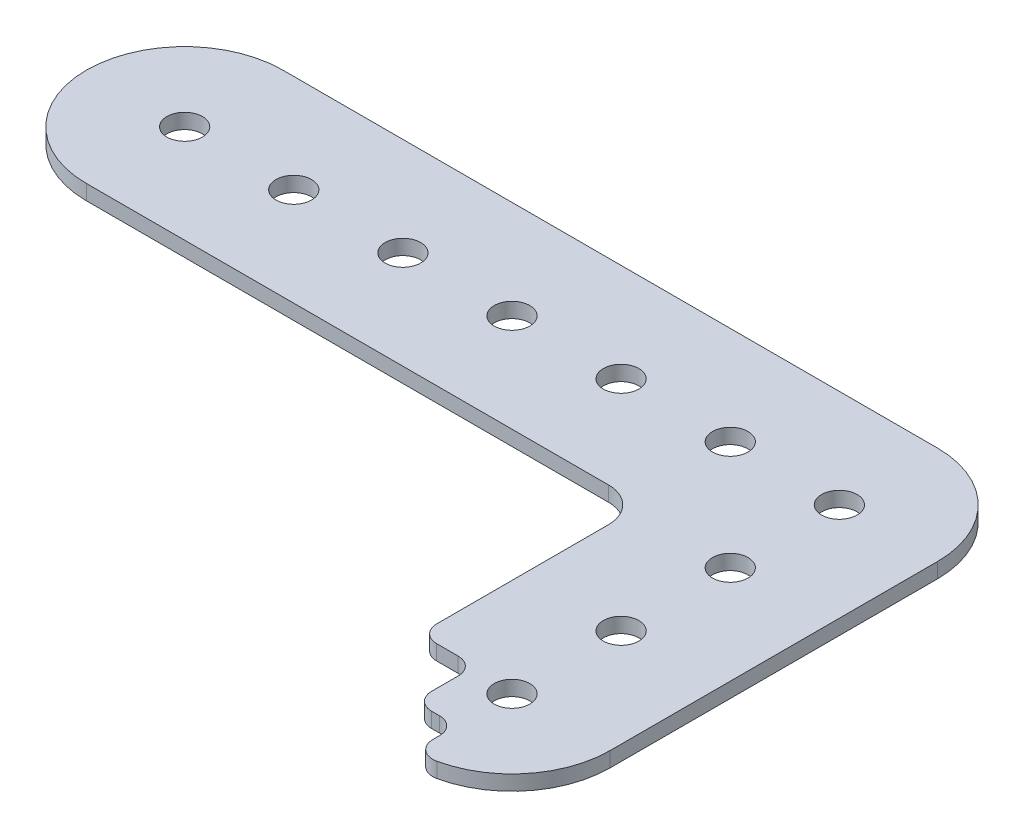
ISO-10303-21;
HEADER;
FILE_DESCRIPTION(('STEP AP214'),'2;1');
FILE_NAME('part.step','',(''),(''),'','','');
FILE_SCHEMA(('AUTOMOTIVE_DESIGN { 1 0 10303 214 1 1 1 1 }'));
ENDSEC;
DATA;
#1=APPLICATION_CONTEXT('core data for automotive mechanical design processes');
#2=APPLICATION_PROTOCOL_DEFINITION('international standard','automotive_design',2000,#1);
#3=PRODUCT_CONTEXT('',#1,'mechanical');
#4=PRODUCT('Part','Part','',(#3));
#5=PRODUCT_RELATED_PRODUCT_CATEGORY('part','',(#4));
#6=PRODUCT_DEFINITION_FORMATION('','',#4);
#7=PRODUCT_DEFINITION_CONTEXT('part definition',#1,'design');
#8=PRODUCT_DEFINITION('design','',#6,#7);
#9=PRODUCT_DEFINITION_SHAPE('','',#8);
#10=(LENGTH_UNIT() NAMED_UNIT(*) SI_UNIT(.MILLI.,.METRE.));
#11=(NAMED_UNIT(*) PLANE_ANGLE_UNIT() SI_UNIT($,.RADIAN.));
#12=(NAMED_UNIT(*) SI_UNIT($,.STERADIAN.) SOLID_ANGLE_UNIT());
#13=UNCERTAINTY_MEASURE_WITH_UNIT(LENGTH_MEASURE(1.E-05),#10,'distance_accuracy_value','');
#14=(GEOMETRIC_REPRESENTATION_CONTEXT(3) GLOBAL_UNCERTAINTY_ASSIGNED_CONTEXT((#13)) GLOBAL_UNIT_ASSIGNED_CONTEXT((#10,
#11,#12)) REPRESENTATION_CONTEXT('',''));
#15=CARTESIAN_POINT('',(0.,0.,0.));
#16=DIRECTION('',(0.,0.,1.));
#17=DIRECTION('',(1.,0.,0.));
#18=AXIS2_PLACEMENT_3D('',#15,#16,#17);
#19=CARTESIAN_POINT('',(11.4299999999997,0.875,0.));
#20=DIRECTION('',(-1.,0.,0.));
#21=DIRECTION('',(0.,0.,1.));
#22=AXIS2_PLACEMENT_3D('',#19,#20,#21);
#23=PLANE('',#22);
#24=DIRECTION('',(0.,0.,-1.));
#25=VECTOR('',#24,1.);
#26=CARTESIAN_POINT('',(11.4299999999997,-0.875,0.));
#27=LINE('',#26,#25);
#28=CARTESIAN_POINT('',(11.4300000000002,-0.875,38.0999999999999));
#29=VERTEX_POINT('',#28);
#30=CARTESIAN_POINT('',(11.4299999999999,-0.875,0.));
#31=VERTEX_POINT('',#30);
#32=EDGE_CURVE('E192',#29,#31,#27,.T.);
#33=ORIENTED_EDGE('',*,*,#32,.T.);
#34=DIRECTION('',(0.,-1.,0.));
#35=VECTOR('',#34,1.);
#36=CARTESIAN_POINT('',(11.4299999999999,0.875,0.));
#37=LINE('',#36,#35);
#38=CARTESIAN_POINT('',(11.4299999999999,0.875,0.));
#39=VERTEX_POINT('',#38);
#40=EDGE_CURVE('E169',#39,#31,#37,.T.);
#41=ORIENTED_EDGE('',*,*,#40,.F.);
#42=DIRECTION('',(0.,0.,-1.));
#43=VECTOR('',#42,1.);
#44=CARTESIAN_POINT('',(11.4299999999997,0.875,0.));
#45=LINE('',#44,#43);
#46=CARTESIAN_POINT('',(11.4300000000002,0.875,38.0999999999999));
#47=VERTEX_POINT('',#46);
#48=EDGE_CURVE('E177',#47,#39,#45,.T.);
#49=ORIENTED_EDGE('',*,*,#48,.F.);
#50=DIRECTION('',(0.,-1.,0.));
#51=VECTOR('',#50,1.);
#52=CARTESIAN_POINT('',(11.4300000000002,0.875,38.0999999999999));
#53=LINE('',#52,#51);
#54=EDGE_CURVE('E277',#47,#29,#53,.T.);
#55=ORIENTED_EDGE('',*,*,#54,.T.);
#56=EDGE_LOOP('',(#33,#41,#49,#55));
#57=FACE_BOUND('',#56,.T.);
#58=ADVANCED_FACE('F44',(#57),#23,.F.);
#59=CARTESIAN_POINT('',(0.,0.875,0.));
#60=DIRECTION('',(0.,-1.,0.));
#61=DIRECTION('',(0.,0.,-1.));
#62=AXIS2_PLACEMENT_3D('',#59,#60,#61);
#63=CYLINDRICAL_SURFACE('',#62,11.43);
#64=CARTESIAN_POINT('',(0.,-0.875,0.));
#65=DIRECTION('',(0.,1.,0.));
#66=DIRECTION('',(0.,0.,1.));
#67=AXIS2_PLACEMENT_3D('',#64,#65,#66);
#68=CIRCLE('',#67,11.43);
#69=CARTESIAN_POINT('',(0.,-0.875,-11.43));
#70=VERTEX_POINT('',#69);
#71=EDGE_CURVE('E386',#31,#70,#68,.T.);
#72=ORIENTED_EDGE('',*,*,#71,.T.);
#73=DIRECTION('',(0.,-1.,0.));
#74=VECTOR('',#73,1.);
#75=CARTESIAN_POINT('',(0.,0.875,-11.43));
#76=LINE('',#75,#74);
#77=CARTESIAN_POINT('',(0.,0.875,-11.43));
#78=VERTEX_POINT('',#77);
#79=EDGE_CURVE('E171',#78,#70,#76,.T.);
#80=ORIENTED_EDGE('',*,*,#79,.F.);
#81=CARTESIAN_POINT('',(0.,0.875,0.));
#82=DIRECTION('',(0.,1.,0.));
#83=DIRECTION('',(0.,0.,1.));
#84=AXIS2_PLACEMENT_3D('',#81,#82,#83);
#85=CIRCLE('',#84,11.43);
#86=EDGE_CURVE('E164',#39,#78,#85,.T.);
#87=ORIENTED_EDGE('',*,*,#86,.F.);
#88=ORIENTED_EDGE('',*,*,#40,.T.);
#89=EDGE_LOOP('',(#72,#80,#87,#88));
#90=FACE_BOUND('',#89,.T.);
#91=ADVANCED_FACE('F167',(#90),#63,.T.);
#92=CARTESIAN_POINT('',(0.,0.875,-11.43));
#93=DIRECTION('',(0.,0.,-1.));
#94=DIRECTION('',(-1.,0.,0.));
#95=AXIS2_PLACEMENT_3D('',#92,#93,#94);
#96=PLANE('',#95);
#97=DIRECTION('',(1.,0.,0.));
#98=VECTOR('',#97,1.);
#99=CARTESIAN_POINT('',(0.,-0.875,-11.43));
#100=LINE('',#99,#98);
#101=CARTESIAN_POINT('',(-76.2,-0.875,-11.4299999999998));
#102=VERTEX_POINT('',#101);
#103=EDGE_CURVE('E383',#102,#70,#100,.T.);
#104=ORIENTED_EDGE('',*,*,#103,.F.);
#105=DIRECTION('',(0.,-1.,0.));
#106=VECTOR('',#105,1.);
#107=CARTESIAN_POINT('',(-76.2,0.875,-11.4299999999998));
#108=LINE('',#107,#106);
#109=CARTESIAN_POINT('',(-76.2,0.875,-11.4299999999998));
#110=VERTEX_POINT('',#109);
#111=EDGE_CURVE('E198',#110,#102,#108,.T.);
#112=ORIENTED_EDGE('',*,*,#111,.F.);
#113=DIRECTION('',(1.,0.,0.));
#114=VECTOR('',#113,1.);
#115=CARTESIAN_POINT('',(0.,0.875,-11.43));
#116=LINE('',#115,#114);
#117=EDGE_CURVE('E176',#110,#78,#116,.T.);
#118=ORIENTED_EDGE('',*,*,#117,.T.);
#119=ORIENTED_EDGE('',*,*,#79,.T.);
#120=EDGE_LOOP('',(#104,#112,#118,#119));
#121=FACE_BOUND('',#120,.T.);
#122=ADVANCED_FACE('F385',(#121),#96,.T.);
#123=CARTESIAN_POINT('',(-76.2,0.875,5.32101756039694E-13));
#124=DIRECTION('',(0.,-1.,0.));
#125=DIRECTION('',(0.,0.,-1.));
#126=AXIS2_PLACEMENT_3D('',#123,#124,#125);
#127=CYLINDRICAL_SURFACE('',#126,11.4300000000002);
#128=CARTESIAN_POINT('',(-76.2,-0.875,5.32101756039694E-13));
#129=DIRECTION('',(0.,1.,0.));
#130=DIRECTION('',(0.,0.,1.));
#131=AXIS2_PLACEMENT_3D('',#128,#129,#130);
#132=CIRCLE('',#131,11.4300000000002);
#133=CARTESIAN_POINT('',(-76.2,-0.875,11.4300000000003));
#134=VERTEX_POINT('',#133);
#135=EDGE_CURVE('E273',#102,#134,#132,.T.);
#136=ORIENTED_EDGE('',*,*,#135,.T.);
#137=DIRECTION('',(0.,-1.,0.));
#138=VECTOR('',#137,1.);
#139=CARTESIAN_POINT('',(-76.2,0.875,11.4300000000003));
#140=LINE('',#139,#138);
#141=CARTESIAN_POINT('',(-76.2,0.875,11.4300000000003));
#142=VERTEX_POINT('',#141);
#143=EDGE_CURVE('E270',#142,#134,#140,.T.);
#144=ORIENTED_EDGE('',*,*,#143,.F.);
#145=CARTESIAN_POINT('',(-76.2,0.875,5.32101756039694E-13));
#146=DIRECTION('',(0.,1.,0.));
#147=DIRECTION('',(0.,0.,1.));
#148=AXIS2_PLACEMENT_3D('',#145,#146,#147);
#149=CIRCLE('',#148,11.4300000000002);
#150=EDGE_CURVE('E252',#110,#142,#149,.T.);
#151=ORIENTED_EDGE('',*,*,#150,.F.);
#152=ORIENTED_EDGE('',*,*,#111,.T.);
#153=EDGE_LOOP('',(#136,#144,#151,#152));
#154=FACE_BOUND('',#153,.T.);
#155=ADVANCED_FACE('F271',(#154),#127,.T.);
#156=CARTESIAN_POINT('',(0.,0.875,11.43));
#157=DIRECTION('',(0.,0.,-1.));
#158=DIRECTION('',(-1.,0.,0.));
#159=AXIS2_PLACEMENT_3D('',#156,#157,#158);
#160=PLANE('',#159);
#161=DIRECTION('',(1.,0.,0.));
#162=VECTOR('',#161,1.);
#163=CARTESIAN_POINT('',(0.,-0.875,11.43));
#164=LINE('',#163,#162);
#165=CARTESIAN_POINT('',(-15.43,-0.875,11.43));
#166=VERTEX_POINT('',#165);
#167=EDGE_CURVE('E281',#134,#166,#164,.T.);
#168=ORIENTED_EDGE('',*,*,#167,.T.);
#169=DIRECTION('',(0.,-1.,0.));
#170=VECTOR('',#169,1.);
#171=CARTESIAN_POINT('',(-15.43,0.875,11.43));
#172=LINE('',#171,#170);
#173=CARTESIAN_POINT('',(-15.43,0.875,11.43));
#174=VERTEX_POINT('',#173);
#175=EDGE_CURVE('E196',#166,#174,#172,.F.);
#176=ORIENTED_EDGE('',*,*,#175,.T.);
#177=DIRECTION('',(1.,0.,0.));
#178=VECTOR('',#177,1.);
#179=CARTESIAN_POINT('',(0.,0.875,11.43));
#180=LINE('',#179,#178);
#181=EDGE_CURVE('E258',#142,#174,#180,.T.);
#182=ORIENTED_EDGE('',*,*,#181,.F.);
#183=ORIENTED_EDGE('',*,*,#143,.T.);
#184=EDGE_LOOP('',(#168,#176,#182,#183));
#185=FACE_BOUND('',#184,.T.);
#186=ADVANCED_FACE('F279',(#185),#160,.F.);
#187=CARTESIAN_POINT('',(-11.43,0.875,0.));
#188=DIRECTION('',(-1.,0.,0.));
#189=DIRECTION('',(0.,0.,1.));
#190=AXIS2_PLACEMENT_3D('',#187,#188,#189);
#191=PLANE('',#190);
#192=DIRECTION('',(0.,0.,-1.));
#193=VECTOR('',#192,1.);
#194=CARTESIAN_POINT('',(-11.43,-0.875,0.));
#195=LINE('',#194,#193);
#196=CARTESIAN_POINT('',(-11.43,-0.875,35.43));
#197=VERTEX_POINT('',#196);
#198=CARTESIAN_POINT('',(-11.43,-0.875,15.43));
#199=VERTEX_POINT('',#198);
#200=EDGE_CURVE('E293',#197,#199,#195,.T.);
#201=ORIENTED_EDGE('',*,*,#200,.F.);
#202=DIRECTION('',(0.,1.,0.));
#203=VECTOR('',#202,1.);
#204=CARTESIAN_POINT('',(-11.43,0.875,35.43));
#205=LINE('',#204,#203);
#206=CARTESIAN_POINT('',(-11.43,0.875,35.43));
#207=VERTEX_POINT('',#206);
#208=EDGE_CURVE('E292',#197,#207,#205,.T.);
#209=ORIENTED_EDGE('',*,*,#208,.T.);
#210=DIRECTION('',(0.,0.,-1.));
#211=VECTOR('',#210,1.);
#212=CARTESIAN_POINT('',(-11.43,0.875,0.));
#213=LINE('',#212,#211);
#214=CARTESIAN_POINT('',(-11.43,0.875,15.43));
#215=VERTEX_POINT('',#214);
#216=EDGE_CURVE('E224',#207,#215,#213,.T.);
#217=ORIENTED_EDGE('',*,*,#216,.T.);
#218=DIRECTION('',(0.,-1.,0.));
#219=VECTOR('',#218,1.);
#220=CARTESIAN_POINT('',(-11.43,0.875,15.43));
#221=LINE('',#220,#219);
#222=EDGE_CURVE('E193',#215,#199,#221,.T.);
#223=ORIENTED_EDGE('',*,*,#222,.T.);
#224=EDGE_LOOP('',(#201,#209,#217,#223));
#225=FACE_BOUND('',#224,.T.);
#226=ADVANCED_FACE('F290',(#225),#191,.T.);
#227=CARTESIAN_POINT('',(0.,0.875,0.));
#228=DIRECTION('',(0.,-1.,0.));
#229=DIRECTION('',(0.,0.,-1.));
#230=AXIS2_PLACEMENT_3D('',#227,#228,#229);
#231=CYLINDRICAL_SURFACE('',#230,2.07);
#232=CARTESIAN_POINT('',(0.,0.875,0.));
#233=DIRECTION('',(0.,1.,0.));
#234=DIRECTION('',(0.,0.,1.));
#235=AXIS2_PLACEMENT_3D('',#232,#233,#234);
#236=CIRCLE('',#235,2.07);
#237=CARTESIAN_POINT('',(0.,0.875,2.07));
#238=VERTEX_POINT('',#237);
#239=EDGE_CURVE('E397',#238,#238,#236,.T.);
#240=ORIENTED_EDGE('',*,*,#239,.T.);
#241=EDGE_LOOP('',(#240));
#242=FACE_BOUND('',#241,.T.);
#243=CARTESIAN_POINT('',(0.,-0.875,0.));
#244=DIRECTION('',(0.,1.,0.));
#245=DIRECTION('',(0.,0.,1.));
#246=AXIS2_PLACEMENT_3D('',#243,#244,#245);
#247=CIRCLE('',#246,2.07);
#248=CARTESIAN_POINT('',(0.,-0.875,2.07));
#249=VERTEX_POINT('',#248);
#250=EDGE_CURVE('E370',#249,#249,#247,.T.);
#251=ORIENTED_EDGE('',*,*,#250,.F.);
#252=EDGE_LOOP('',(#251));
#253=FACE_BOUND('',#252,.T.);
#254=ADVANCED_FACE('F565',(#242,#253),#231,.F.);
#255=CARTESIAN_POINT('',(-25.4,0.875,1.77367252013231E-13));
#256=DIRECTION('',(0.,-1.,0.));
#257=DIRECTION('',(0.,0.,-1.));
#258=AXIS2_PLACEMENT_3D('',#255,#256,#257);
#259=CYLINDRICAL_SURFACE('',#258,2.07);
#260=CARTESIAN_POINT('',(-25.4,0.875,1.77367252013231E-13));
#261=DIRECTION('',(0.,1.,0.));
#262=DIRECTION('',(0.,0.,1.));
#263=AXIS2_PLACEMENT_3D('',#260,#261,#262);
#264=CIRCLE('',#263,2.07);
#265=CARTESIAN_POINT('',(-25.4,0.875,2.07000000000018));
#266=VERTEX_POINT('',#265);
#267=EDGE_CURVE('E402',#266,#266,#264,.T.);
#268=ORIENTED_EDGE('',*,*,#267,.T.);
#269=EDGE_LOOP('',(#268));
#270=FACE_BOUND('',#269,.T.);
#271=CARTESIAN_POINT('',(-25.4,-0.875,1.77367252013231E-13));
#272=DIRECTION('',(0.,1.,0.));
#273=DIRECTION('',(0.,0.,1.));
#274=AXIS2_PLACEMENT_3D('',#271,#272,#273);
#275=CIRCLE('',#274,2.07);
#276=CARTESIAN_POINT('',(-25.4,-0.875,2.07000000000018));
#277=VERTEX_POINT('',#276);
#278=EDGE_CURVE('E367',#277,#277,#275,.T.);
#279=ORIENTED_EDGE('',*,*,#278,.F.);
#280=EDGE_LOOP('',(#279));
#281=FACE_BOUND('',#280,.T.);
#282=ADVANCED_FACE('F594',(#270,#281),#259,.F.);
#283=CARTESIAN_POINT('',(-38.1,0.875,2.66050878019847E-13));
#284=DIRECTION('',(0.,-1.,0.));
#285=DIRECTION('',(0.,0.,-1.));
#286=AXIS2_PLACEMENT_3D('',#283,#284,#285);
#287=CYLINDRICAL_SURFACE('',#286,2.07);
#288=CARTESIAN_POINT('',(-38.1,0.875,2.66050878019847E-13));
#289=DIRECTION('',(0.,1.,0.));
#290=DIRECTION('',(0.,0.,1.));
#291=AXIS2_PLACEMENT_3D('',#288,#289,#290);
#292=CIRCLE('',#291,2.07);
#293=CARTESIAN_POINT('',(-38.1,0.875,2.07000000000027));
#294=VERTEX_POINT('',#293);
#295=EDGE_CURVE('E410',#294,#294,#292,.T.);
#296=ORIENTED_EDGE('',*,*,#295,.T.);
#297=EDGE_LOOP('',(#296));
#298=FACE_BOUND('',#297,.T.);
#299=CARTESIAN_POINT('',(-38.1,-0.875,2.66050878019847E-13));
#300=DIRECTION('',(0.,1.,0.));
#301=DIRECTION('',(0.,0.,1.));
#302=AXIS2_PLACEMENT_3D('',#299,#300,#301);
#303=CIRCLE('',#302,2.07);
#304=CARTESIAN_POINT('',(-38.1,-0.875,2.07000000000027));
#305=VERTEX_POINT('',#304);
#306=EDGE_CURVE('E364',#305,#305,#303,.T.);
#307=ORIENTED_EDGE('',*,*,#306,.F.);
#308=EDGE_LOOP('',(#307));
#309=FACE_BOUND('',#308,.T.);
#310=ADVANCED_FACE('F602',(#298,#309),#287,.F.);
#311=CARTESIAN_POINT('',(-50.8,0.875,3.54734504026462E-13));
#312=DIRECTION('',(0.,-1.,0.));
#313=DIRECTION('',(0.,0.,-1.));
#314=AXIS2_PLACEMENT_3D('',#311,#312,#313);
#315=CYLINDRICAL_SURFACE('',#314,2.07);
#316=CARTESIAN_POINT('',(-50.8,0.875,3.54734504026462E-13));
#317=DIRECTION('',(0.,1.,0.));
#318=DIRECTION('',(0.,0.,1.));
#319=AXIS2_PLACEMENT_3D('',#316,#317,#318);
#320=CIRCLE('',#319,2.07);
#321=CARTESIAN_POINT('',(-50.8,0.875,2.07000000000036));
#322=VERTEX_POINT('',#321);
#323=EDGE_CURVE('E414',#322,#322,#320,.T.);
#324=ORIENTED_EDGE('',*,*,#323,.T.);
#325=EDGE_LOOP('',(#324));
#326=FACE_BOUND('',#325,.T.);
#327=CARTESIAN_POINT('',(-50.8,-0.875,3.54734504026462E-13));
#328=DIRECTION('',(0.,1.,0.));
#329=DIRECTION('',(0.,0.,1.));
#330=AXIS2_PLACEMENT_3D('',#327,#328,#329);
#331=CIRCLE('',#330,2.07);
#332=CARTESIAN_POINT('',(-50.8,-0.875,2.07000000000036));
#333=VERTEX_POINT('',#332);
#334=EDGE_CURVE('E361',#333,#333,#331,.T.);
#335=ORIENTED_EDGE('',*,*,#334,.F.);
#336=EDGE_LOOP('',(#335));
#337=FACE_BOUND('',#336,.T.);
#338=ADVANCED_FACE('F610',(#326,#337),#315,.F.);
#339=CARTESIAN_POINT('',(-63.5,0.875,4.43418130033078E-13));
#340=DIRECTION('',(0.,-1.,0.));
#341=DIRECTION('',(0.,0.,-1.));
#342=AXIS2_PLACEMENT_3D('',#339,#340,#341);
#343=CYLINDRICAL_SURFACE('',#342,2.07);
#344=CARTESIAN_POINT('',(-63.5,0.875,4.43418130033078E-13));
#345=DIRECTION('',(0.,1.,0.));
#346=DIRECTION('',(0.,0.,1.));
#347=AXIS2_PLACEMENT_3D('',#344,#345,#346);
#348=CIRCLE('',#347,2.07);
#349=CARTESIAN_POINT('',(-63.5,0.875,2.07000000000044));
#350=VERTEX_POINT('',#349);
#351=EDGE_CURVE('E419',#350,#350,#348,.T.);
#352=ORIENTED_EDGE('',*,*,#351,.T.);
#353=EDGE_LOOP('',(#352));
#354=FACE_BOUND('',#353,.T.);
#355=CARTESIAN_POINT('',(-63.5,-0.875,4.43418130033078E-13));
#356=DIRECTION('',(0.,1.,0.));
#357=DIRECTION('',(0.,0.,1.));
#358=AXIS2_PLACEMENT_3D('',#355,#356,#357);
#359=CIRCLE('',#358,2.07);
#360=CARTESIAN_POINT('',(-63.5,-0.875,2.07000000000044));
#361=VERTEX_POINT('',#360);
#362=EDGE_CURVE('E358',#361,#361,#359,.T.);
#363=ORIENTED_EDGE('',*,*,#362,.F.);
#364=EDGE_LOOP('',(#363));
#365=FACE_BOUND('',#364,.T.);
#366=ADVANCED_FACE('F618',(#354,#365),#343,.F.);
#367=CARTESIAN_POINT('',(-76.2,0.875,5.32101756039694E-13));
#368=DIRECTION('',(0.,-1.,0.));
#369=DIRECTION('',(0.,0.,-1.));
#370=AXIS2_PLACEMENT_3D('',#367,#368,#369);
#371=CYLINDRICAL_SURFACE('',#370,2.07);
#372=CARTESIAN_POINT('',(-76.2,0.875,5.32101756039694E-13));
#373=DIRECTION('',(0.,1.,0.));
#374=DIRECTION('',(0.,0.,1.));
#375=AXIS2_PLACEMENT_3D('',#372,#373,#374);
#376=CIRCLE('',#375,2.07);
#377=CARTESIAN_POINT('',(-76.2,0.875,2.07000000000053));
#378=VERTEX_POINT('',#377);
#379=EDGE_CURVE('E424',#378,#378,#376,.T.);
#380=ORIENTED_EDGE('',*,*,#379,.T.);
#381=EDGE_LOOP('',(#380));
#382=FACE_BOUND('',#381,.T.);
#383=CARTESIAN_POINT('',(-76.2,-0.875,5.32101756039694E-13));
#384=DIRECTION('',(0.,1.,0.));
#385=DIRECTION('',(0.,0.,1.));
#386=AXIS2_PLACEMENT_3D('',#383,#384,#385);
#387=CIRCLE('',#386,2.07);
#388=CARTESIAN_POINT('',(-76.2,-0.875,2.07000000000053));
#389=VERTEX_POINT('',#388);
#390=EDGE_CURVE('E355',#389,#389,#387,.T.);
#391=ORIENTED_EDGE('',*,*,#390,.F.);
#392=EDGE_LOOP('',(#391));
#393=FACE_BOUND('',#392,.T.);
#394=ADVANCED_FACE('F626',(#382,#393),#371,.F.);
#395=CARTESIAN_POINT('',(1.32247788292465E-13,0.875,12.7));
#396=DIRECTION('',(0.,-1.,0.));
#397=DIRECTION('',(0.,0.,-1.));
#398=AXIS2_PLACEMENT_3D('',#395,#396,#397);
#399=CYLINDRICAL_SURFACE('',#398,2.07);
#400=CARTESIAN_POINT('',(1.32247788292465E-13,0.875,12.7));
#401=DIRECTION('',(0.,1.,0.));
#402=DIRECTION('',(0.,0.,1.));
#403=AXIS2_PLACEMENT_3D('',#400,#401,#402);
#404=CIRCLE('',#403,2.07);
#405=CARTESIAN_POINT('',(1.32247788292465E-13,0.875,14.77));
#406=VERTEX_POINT('',#405);
#407=EDGE_CURVE('E430',#406,#406,#404,.T.);
#408=ORIENTED_EDGE('',*,*,#407,.T.);
#409=EDGE_LOOP('',(#408));
#410=FACE_BOUND('',#409,.T.);
#411=CARTESIAN_POINT('',(1.32247788292465E-13,-0.875,12.7));
#412=DIRECTION('',(0.,1.,0.));
#413=DIRECTION('',(0.,0.,1.));
#414=AXIS2_PLACEMENT_3D('',#411,#412,#413);
#415=CIRCLE('',#414,2.07);
#416=CARTESIAN_POINT('',(1.32247788292465E-13,-0.875,14.77));
#417=VERTEX_POINT('',#416);
#418=EDGE_CURVE('E352',#417,#417,#415,.T.);
#419=ORIENTED_EDGE('',*,*,#418,.F.);
#420=EDGE_LOOP('',(#419));
#421=FACE_BOUND('',#420,.T.);
#422=ADVANCED_FACE('F559',(#410,#421),#399,.F.);
#423=CARTESIAN_POINT('',(-12.7,0.875,0.));
#424=DIRECTION('',(0.,-1.,0.));
#425=DIRECTION('',(0.,0.,-1.));
#426=AXIS2_PLACEMENT_3D('',#423,#424,#425);
#427=CYLINDRICAL_SURFACE('',#426,2.07);
#428=CARTESIAN_POINT('',(-12.7,0.875,0.));
#429=DIRECTION('',(0.,1.,0.));
#430=DIRECTION('',(0.,0.,1.));
#431=AXIS2_PLACEMENT_3D('',#428,#429,#430);
#432=CIRCLE('',#431,2.07);
#433=CARTESIAN_POINT('',(-12.7,0.875,2.07000000000009));
#434=VERTEX_POINT('',#433);
#435=EDGE_CURVE('E223',#434,#434,#432,.T.);
#436=ORIENTED_EDGE('',*,*,#435,.T.);
#437=EDGE_LOOP('',(#436));
#438=FACE_BOUND('',#437,.T.);
#439=CARTESIAN_POINT('',(-12.7,-0.875,0.));
#440=DIRECTION('',(0.,1.,0.));
#441=DIRECTION('',(0.,0.,1.));
#442=AXIS2_PLACEMENT_3D('',#439,#440,#441);
#443=CIRCLE('',#442,2.07);
#444=CARTESIAN_POINT('',(-12.7,-0.875,2.07000000000009));
#445=VERTEX_POINT('',#444);
#446=EDGE_CURVE('E343',#445,#445,#443,.T.);
#447=ORIENTED_EDGE('',*,*,#446,.F.);
#448=EDGE_LOOP('',(#447));
#449=FACE_BOUND('',#448,.T.);
#450=ADVANCED_FACE('F443',(#438,#449),#427,.F.);
#451=CARTESIAN_POINT('',(3.96743364877394E-13,0.875,38.1));
#452=DIRECTION('',(0.,-1.,0.));
#453=DIRECTION('',(0.,0.,-1.));
#454=AXIS2_PLACEMENT_3D('',#451,#452,#453);
#455=CYLINDRICAL_SURFACE('',#454,11.43);
#456=CARTESIAN_POINT('',(3.96743364877394E-13,0.875,38.1));
#457=DIRECTION('',(0.,1.,0.));
#458=DIRECTION('',(0.,0.,1.));
#459=AXIS2_PLACEMENT_3D('',#456,#457,#458);
#460=CIRCLE('',#459,11.43);
#461=CARTESIAN_POINT('',(2.42417815482529,0.875,49.2699713640488));
#462=VERTEX_POINT('',#461);
#463=EDGE_CURVE('E184',#462,#47,#460,.T.);
#464=ORIENTED_EDGE('',*,*,#463,.F.);
#465=DIRECTION('',(0.,-1.,0.));
#466=VECTOR('',#465,1.);
#467=CARTESIAN_POINT('',(2.42417815482529,0.875,49.2699713640488));
#468=LINE('',#467,#466);
#469=CARTESIAN_POINT('',(2.42417815482529,-0.875,49.2699713640488));
#470=VERTEX_POINT('',#469);
#471=EDGE_CURVE('E338',#462,#470,#468,.T.);
#472=ORIENTED_EDGE('',*,*,#471,.T.);
#473=CARTESIAN_POINT('',(3.96743364877394E-13,-0.875,38.1));
#474=DIRECTION('',(0.,1.,0.));
#475=DIRECTION('',(0.,0.,1.));
#476=AXIS2_PLACEMENT_3D('',#473,#474,#475);
#477=CIRCLE('',#476,11.43);
#478=EDGE_CURVE('E341',#470,#29,#477,.T.);
#479=ORIENTED_EDGE('',*,*,#478,.T.);
#480=ORIENTED_EDGE('',*,*,#54,.F.);
#481=EDGE_LOOP('',(#464,#472,#479,#480));
#482=FACE_BOUND('',#481,.T.);
#483=ADVANCED_FACE('F489',(#482),#455,.T.);
#484=CARTESIAN_POINT('',(2.6449557658493E-13,0.875,25.4));
#485=DIRECTION('',(0.,-1.,0.));
#486=DIRECTION('',(0.,0.,-1.));
#487=AXIS2_PLACEMENT_3D('',#484,#485,#486);
#488=CYLINDRICAL_SURFACE('',#487,2.07);
#489=CARTESIAN_POINT('',(2.6449557658493E-13,0.875,25.4));
#490=DIRECTION('',(0.,1.,0.));
#491=DIRECTION('',(0.,0.,1.));
#492=AXIS2_PLACEMENT_3D('',#489,#490,#491);
#493=CIRCLE('',#492,2.07);
#494=CARTESIAN_POINT('',(2.6449557658493E-13,0.875,27.47));
#495=VERTEX_POINT('',#494);
#496=EDGE_CURVE('E189',#495,#495,#493,.T.);
#497=ORIENTED_EDGE('',*,*,#496,.T.);
#498=EDGE_LOOP('',(#497));
#499=FACE_BOUND('',#498,.T.);
#500=CARTESIAN_POINT('',(2.6449557658493E-13,-0.875,25.4));
#501=DIRECTION('',(0.,1.,0.));
#502=DIRECTION('',(0.,0.,1.));
#503=AXIS2_PLACEMENT_3D('',#500,#501,#502);
#504=CIRCLE('',#503,2.07);
#505=CARTESIAN_POINT('',(2.6449557658493E-13,-0.875,27.47));
#506=VERTEX_POINT('',#505);
#507=EDGE_CURVE('E391',#506,#506,#504,.T.);
#508=ORIENTED_EDGE('',*,*,#507,.F.);
#509=EDGE_LOOP('',(#508));
#510=FACE_BOUND('',#509,.T.);
#511=ADVANCED_FACE('F468',(#499,#510),#488,.F.);
#512=CARTESIAN_POINT('',(3.96743364877394E-13,0.875,38.1));
#513=DIRECTION('',(0.,-1.,0.));
#514=DIRECTION('',(0.,0.,-1.));
#515=AXIS2_PLACEMENT_3D('',#512,#513,#514);
#516=CYLINDRICAL_SURFACE('',#515,2.07);
#517=CARTESIAN_POINT('',(3.96743364877394E-13,0.875,38.1));
#518=DIRECTION('',(0.,1.,0.));
#519=DIRECTION('',(0.,0.,1.));
#520=AXIS2_PLACEMENT_3D('',#517,#518,#519);
#521=CIRCLE('',#520,2.07);
#522=CARTESIAN_POINT('',(3.96743364877394E-13,0.875,40.17));
#523=VERTEX_POINT('',#522);
#524=EDGE_CURVE('E376',#523,#523,#521,.T.);
#525=ORIENTED_EDGE('',*,*,#524,.T.);
#526=EDGE_LOOP('',(#525));
#527=FACE_BOUND('',#526,.T.);
#528=CARTESIAN_POINT('',(3.96743364877394E-13,-0.875,38.1));
#529=DIRECTION('',(0.,1.,0.));
#530=DIRECTION('',(0.,0.,1.));
#531=AXIS2_PLACEMENT_3D('',#528,#529,#530);
#532=CIRCLE('',#531,2.07);
#533=CARTESIAN_POINT('',(3.96743364877394E-13,-0.875,40.17));
#534=VERTEX_POINT('',#533);
#535=EDGE_CURVE('E373',#534,#534,#532,.T.);
#536=ORIENTED_EDGE('',*,*,#535,.F.);
#537=EDGE_LOOP('',(#536));
#538=FACE_BOUND('',#537,.T.);
#539=ADVANCED_FACE('F448',(#527,#538),#516,.F.);
#540=CARTESIAN_POINT('',(0.,0.875,0.));
#541=DIRECTION('',(0.,1.,0.));
#542=DIRECTION('',(0.,0.,1.));
#543=AXIS2_PLACEMENT_3D('',#540,#541,#542);
#544=PLANE('',#543);
#545=DIRECTION('',(-1.03303713995051E-13,0.,-1.));
#546=VECTOR('',#545,1.);
#547=CARTESIAN_POINT('',(0.,0.875,0.));
#548=LINE('',#547,#546);
#549=CARTESIAN_POINT('',(4.88786385148662E-12,0.875,47.315470687925));
#550=VERTEX_POINT('',#549);
#551=CARTESIAN_POINT('',(4.80672181218971E-12,0.875,46.5299999999998));
#552=VERTEX_POINT('',#551);
#553=EDGE_CURVE('E525',#550,#552,#548,.T.);
#554=ORIENTED_EDGE('',*,*,#553,.F.);
#555=CARTESIAN_POINT('',(2.00000000000029,0.875,47.3154706879248));
#556=DIRECTION('',(0.,1.,0.));
#557=DIRECTION('',(0.,0.,1.));
#558=AXIS2_PLACEMENT_3D('',#555,#556,#557);
#559=CIRCLE('',#558,2.);
#560=EDGE_CURVE('E340',#550,#462,#559,.T.);
#561=ORIENTED_EDGE('',*,*,#560,.T.);
#562=ORIENTED_EDGE('',*,*,#463,.T.);
#563=ORIENTED_EDGE('',*,*,#48,.T.);
#564=ORIENTED_EDGE('',*,*,#86,.T.);
#565=ORIENTED_EDGE('',*,*,#117,.F.);
#566=ORIENTED_EDGE('',*,*,#150,.T.);
#567=ORIENTED_EDGE('',*,*,#181,.T.);
#568=CARTESIAN_POINT('',(-15.43,0.875,15.43));
#569=DIRECTION('',(0.,1.,0.));
#570=DIRECTION('',(0.,0.,1.));
#571=AXIS2_PLACEMENT_3D('',#568,#569,#570);
#572=CIRCLE('',#571,4.);
#573=EDGE_CURVE('E205',#174,#215,#572,.F.);
#574=ORIENTED_EDGE('',*,*,#573,.T.);
#575=ORIENTED_EDGE('',*,*,#216,.F.);
#576=CARTESIAN_POINT('',(-9.43,0.875,35.43));
#577=DIRECTION('',(0.,1.,0.));
#578=DIRECTION('',(0.,0.,1.));
#579=AXIS2_PLACEMENT_3D('',#576,#577,#578);
#580=CIRCLE('',#579,2.);
#581=CARTESIAN_POINT('',(-9.43,0.875,37.43));
#582=VERTEX_POINT('',#581);
#583=EDGE_CURVE('E219',#207,#582,#580,.T.);
#584=ORIENTED_EDGE('',*,*,#583,.T.);
#585=DIRECTION('',(-1.,0.,0.));
#586=VECTOR('',#585,1.);
#587=CARTESIAN_POINT('',(0.,0.875,37.43));
#588=LINE('',#587,#586);
#589=CARTESIAN_POINT('',(-6.9299999999998,0.875,37.43));
#590=VERTEX_POINT('',#589);
#591=EDGE_CURVE('E310',#590,#582,#588,.T.);
#592=ORIENTED_EDGE('',*,*,#591,.F.);
#593=CARTESIAN_POINT('',(-6.9299999999998,0.875,39.43));
#594=DIRECTION('',(0.,1.,0.));
#595=DIRECTION('',(0.,0.,1.));
#596=AXIS2_PLACEMENT_3D('',#593,#594,#595);
#597=CIRCLE('',#596,2.);
#598=CARTESIAN_POINT('',(-4.9299999999998,0.875,39.43));
#599=VERTEX_POINT('',#598);
#600=EDGE_CURVE('E52',#590,#599,#597,.F.);
#601=ORIENTED_EDGE('',*,*,#600,.T.);
#602=DIRECTION('',(0.,0.,-1.));
#603=VECTOR('',#602,1.);
#604=CARTESIAN_POINT('',(-4.92999999999981,0.875,0.));
#605=LINE('',#604,#603);
#606=CARTESIAN_POINT('',(-4.9299999999998,0.875,42.53));
#607=VERTEX_POINT('',#606);
#608=EDGE_CURVE('E225',#607,#599,#605,.T.);
#609=ORIENTED_EDGE('',*,*,#608,.F.);
#610=CARTESIAN_POINT('',(-2.9299999999998,0.875,42.53));
#611=DIRECTION('',(0.,1.,0.));
#612=DIRECTION('',(0.,0.,1.));
#613=AXIS2_PLACEMENT_3D('',#610,#611,#612);
#614=CIRCLE('',#613,2.);
#615=CARTESIAN_POINT('',(-2.9299999999998,0.875,44.53));
#616=VERTEX_POINT('',#615);
#617=EDGE_CURVE('E511',#607,#616,#614,.T.);
#618=ORIENTED_EDGE('',*,*,#617,.T.);
#619=DIRECTION('',(-1.,0.,0.));
#620=VECTOR('',#619,1.);
#621=CARTESIAN_POINT('',(0.,0.875,44.53));
#622=LINE('',#621,#620);
#623=CARTESIAN_POINT('',(-1.99999999999979,0.875,44.53));
#624=VERTEX_POINT('',#623);
#625=EDGE_CURVE('E530',#624,#616,#622,.T.);
#626=ORIENTED_EDGE('',*,*,#625,.F.);
#627=CARTESIAN_POINT('',(-1.99999999999979,0.875,46.53));
#628=DIRECTION('',(0.,1.,0.));
#629=DIRECTION('',(0.,0.,1.));
#630=AXIS2_PLACEMENT_3D('',#627,#628,#629);
#631=CIRCLE('',#630,2.);
#632=EDGE_CURVE('E295',#624,#552,#631,.F.);
#633=ORIENTED_EDGE('',*,*,#632,.T.);
#634=EDGE_LOOP('',(#554,#561,#562,#563,#564,#565,#566,#567,#574,#575,#584,#592,#601,#609,#618,
#626,#633));
#635=FACE_BOUND('',#634,.T.);
#636=ORIENTED_EDGE('',*,*,#496,.F.);
#637=EDGE_LOOP('',(#636));
#638=FACE_BOUND('',#637,.T.);
#639=ORIENTED_EDGE('',*,*,#435,.F.);
#640=EDGE_LOOP('',(#639));
#641=FACE_BOUND('',#640,.T.);
#642=ORIENTED_EDGE('',*,*,#407,.F.);
#643=EDGE_LOOP('',(#642));
#644=FACE_BOUND('',#643,.T.);
#645=ORIENTED_EDGE('',*,*,#379,.F.);
#646=EDGE_LOOP('',(#645));
#647=FACE_BOUND('',#646,.T.);
#648=ORIENTED_EDGE('',*,*,#351,.F.);
#649=EDGE_LOOP('',(#648));
#650=FACE_BOUND('',#649,.T.);
#651=ORIENTED_EDGE('',*,*,#323,.F.);
#652=EDGE_LOOP('',(#651));
#653=FACE_BOUND('',#652,.T.);
#654=ORIENTED_EDGE('',*,*,#295,.F.);
#655=EDGE_LOOP('',(#654));
#656=FACE_BOUND('',#655,.T.);
#657=ORIENTED_EDGE('',*,*,#267,.F.);
#658=EDGE_LOOP('',(#657));
#659=FACE_BOUND('',#658,.T.);
#660=ORIENTED_EDGE('',*,*,#239,.F.);
#661=EDGE_LOOP('',(#660));
#662=FACE_BOUND('',#661,.T.);
#663=ORIENTED_EDGE('',*,*,#524,.F.);
#664=EDGE_LOOP('',(#663));
#665=FACE_BOUND('',#664,.T.);
#666=ADVANCED_FACE('F181',(#635,#638,#641,#644,#647,#650,#653,#656,#659,#662,#665),#544,.T.);
#667=CARTESIAN_POINT('',(0.,-0.875,0.));
#668=DIRECTION('',(0.,1.,0.));
#669=DIRECTION('',(0.,0.,1.));
#670=AXIS2_PLACEMENT_3D('',#667,#668,#669);
#671=PLANE('',#670);
#672=ORIENTED_EDGE('',*,*,#507,.T.);
#673=EDGE_LOOP('',(#672));
#674=FACE_BOUND('',#673,.T.);
#675=ORIENTED_EDGE('',*,*,#478,.F.);
#676=CARTESIAN_POINT('',(2.00000000000029,-0.875,47.3154706879248));
#677=DIRECTION('',(0.,1.,0.));
#678=DIRECTION('',(0.,0.,1.));
#679=AXIS2_PLACEMENT_3D('',#676,#677,#678);
#680=CIRCLE('',#679,2.);
#681=CARTESIAN_POINT('',(4.88786385148662E-12,-0.875,47.315470687925));
#682=VERTEX_POINT('',#681);
#683=EDGE_CURVE('E333',#470,#682,#680,.F.);
#684=ORIENTED_EDGE('',*,*,#683,.T.);
#685=DIRECTION('',(-1.03303713995051E-13,0.,-1.));
#686=VECTOR('',#685,1.);
#687=CARTESIAN_POINT('',(0.,-0.875,0.));
#688=LINE('',#687,#686);
#689=CARTESIAN_POINT('',(4.80672181218971E-12,-0.875,46.5299999999998));
#690=VERTEX_POINT('',#689);
#691=EDGE_CURVE('E209',#682,#690,#688,.T.);
#692=ORIENTED_EDGE('',*,*,#691,.T.);
#693=CARTESIAN_POINT('',(-1.99999999999979,-0.875,46.53));
#694=DIRECTION('',(0.,1.,0.));
#695=DIRECTION('',(0.,0.,1.));
#696=AXIS2_PLACEMENT_3D('',#693,#694,#695);
#697=CIRCLE('',#696,2.);
#698=CARTESIAN_POINT('',(-1.99999999999979,-0.875,44.53));
#699=VERTEX_POINT('',#698);
#700=EDGE_CURVE('E299',#690,#699,#697,.T.);
#701=ORIENTED_EDGE('',*,*,#700,.T.);
#702=DIRECTION('',(-1.,0.,0.));
#703=VECTOR('',#702,1.);
#704=CARTESIAN_POINT('',(0.,-0.875,44.53));
#705=LINE('',#704,#703);
#706=CARTESIAN_POINT('',(-2.9299999999998,-0.875,44.53));
#707=VERTEX_POINT('',#706);
#708=EDGE_CURVE('E535',#699,#707,#705,.T.);
#709=ORIENTED_EDGE('',*,*,#708,.T.);
#710=CARTESIAN_POINT('',(-2.9299999999998,-0.875,42.53));
#711=DIRECTION('',(0.,1.,0.));
#712=DIRECTION('',(0.,0.,1.));
#713=AXIS2_PLACEMENT_3D('',#710,#711,#712);
#714=CIRCLE('',#713,2.);
#715=CARTESIAN_POINT('',(-4.9299999999998,-0.875,42.53));
#716=VERTEX_POINT('',#715);
#717=EDGE_CURVE('E335',#707,#716,#714,.F.);
#718=ORIENTED_EDGE('',*,*,#717,.T.);
#719=DIRECTION('',(0.,0.,-1.));
#720=VECTOR('',#719,1.);
#721=CARTESIAN_POINT('',(-4.9299999999998,-0.875,37.43));
#722=LINE('',#721,#720);
#723=CARTESIAN_POINT('',(-4.9299999999998,-0.875,39.43));
#724=VERTEX_POINT('',#723);
#725=EDGE_CURVE('E322',#716,#724,#722,.T.);
#726=ORIENTED_EDGE('',*,*,#725,.T.);
#727=CARTESIAN_POINT('',(-6.9299999999998,-0.875,39.43));
#728=DIRECTION('',(0.,1.,0.));
#729=DIRECTION('',(0.,0.,1.));
#730=AXIS2_PLACEMENT_3D('',#727,#728,#729);
#731=CIRCLE('',#730,2.);
#732=CARTESIAN_POINT('',(-6.9299999999998,-0.875,37.43));
#733=VERTEX_POINT('',#732);
#734=EDGE_CURVE('E12',#724,#733,#731,.T.);
#735=ORIENTED_EDGE('',*,*,#734,.T.);
#736=DIRECTION('',(-1.,0.,0.));
#737=VECTOR('',#736,1.);
#738=CARTESIAN_POINT('',(-4.9299999999998,-0.875,37.43));
#739=LINE('',#738,#737);
#740=CARTESIAN_POINT('',(-9.43,-0.875,37.43));
#741=VERTEX_POINT('',#740);
#742=EDGE_CURVE('E523',#733,#741,#739,.T.);
#743=ORIENTED_EDGE('',*,*,#742,.T.);
#744=CARTESIAN_POINT('',(-9.43,-0.875,35.43));
#745=DIRECTION('',(0.,1.,0.));
#746=DIRECTION('',(0.,0.,1.));
#747=AXIS2_PLACEMENT_3D('',#744,#745,#746);
#748=CIRCLE('',#747,2.);
#749=EDGE_CURVE('E59',#741,#197,#748,.F.);
#750=ORIENTED_EDGE('',*,*,#749,.T.);
#751=ORIENTED_EDGE('',*,*,#200,.T.);
#752=CARTESIAN_POINT('',(-15.43,-0.875,15.43));
#753=DIRECTION('',(0.,1.,0.));
#754=DIRECTION('',(0.,0.,1.));
#755=AXIS2_PLACEMENT_3D('',#752,#753,#754);
#756=CIRCLE('',#755,4.);
#757=EDGE_CURVE('E203',#199,#166,#756,.T.);
#758=ORIENTED_EDGE('',*,*,#757,.T.);
#759=ORIENTED_EDGE('',*,*,#167,.F.);
#760=ORIENTED_EDGE('',*,*,#135,.F.);
#761=ORIENTED_EDGE('',*,*,#103,.T.);
#762=ORIENTED_EDGE('',*,*,#71,.F.);
#763=ORIENTED_EDGE('',*,*,#32,.F.);
#764=EDGE_LOOP('',(#675,#684,#692,#701,#709,#718,#726,#735,#743,#750,#751,#758,#759,#760,#761,
#762,#763));
#765=FACE_BOUND('',#764,.T.);
#766=ORIENTED_EDGE('',*,*,#446,.T.);
#767=EDGE_LOOP('',(#766));
#768=FACE_BOUND('',#767,.T.);
#769=ORIENTED_EDGE('',*,*,#418,.T.);
#770=EDGE_LOOP('',(#769));
#771=FACE_BOUND('',#770,.T.);
#772=ORIENTED_EDGE('',*,*,#390,.T.);
#773=EDGE_LOOP('',(#772));
#774=FACE_BOUND('',#773,.T.);
#775=ORIENTED_EDGE('',*,*,#362,.T.);
#776=EDGE_LOOP('',(#775));
#777=FACE_BOUND('',#776,.T.);
#778=ORIENTED_EDGE('',*,*,#334,.T.);
#779=EDGE_LOOP('',(#778));
#780=FACE_BOUND('',#779,.T.);
#781=ORIENTED_EDGE('',*,*,#306,.T.);
#782=EDGE_LOOP('',(#781));
#783=FACE_BOUND('',#782,.T.);
#784=ORIENTED_EDGE('',*,*,#278,.T.);
#785=EDGE_LOOP('',(#784));
#786=FACE_BOUND('',#785,.T.);
#787=ORIENTED_EDGE('',*,*,#250,.T.);
#788=EDGE_LOOP('',(#787));
#789=FACE_BOUND('',#788,.T.);
#790=ORIENTED_EDGE('',*,*,#535,.T.);
#791=EDGE_LOOP('',(#790));
#792=FACE_BOUND('',#791,.T.);
#793=ADVANCED_FACE('F381',(#674,#765,#768,#771,#774,#777,#780,#783,#786,#789,#792),#671,.F.);
#794=CARTESIAN_POINT('',(-15.43,0.875,15.43));
#795=DIRECTION('',(0.,-1.,0.));
#796=DIRECTION('',(0.,0.,-1.));
#797=AXIS2_PLACEMENT_3D('',#794,#795,#796);
#798=CYLINDRICAL_SURFACE('',#797,4.);
#799=ORIENTED_EDGE('',*,*,#573,.F.);
#800=ORIENTED_EDGE('',*,*,#175,.F.);
#801=ORIENTED_EDGE('',*,*,#757,.F.);
#802=ORIENTED_EDGE('',*,*,#222,.F.);
#803=EDGE_LOOP('',(#799,#800,#801,#802));
#804=FACE_BOUND('',#803,.T.);
#805=ADVANCED_FACE('F284',(#804),#798,.F.);
#806=CARTESIAN_POINT('',(-4.9299999999998,-0.875,37.43));
#807=DIRECTION('',(0.,0.,-1.));
#808=DIRECTION('',(-1.,0.,0.));
#809=AXIS2_PLACEMENT_3D('',#806,#807,#808);
#810=PLANE('',#809);
#811=ORIENTED_EDGE('',*,*,#742,.F.);
#812=DIRECTION('',(0.,1.,0.));
#813=VECTOR('',#812,1.);
#814=CARTESIAN_POINT('',(-6.9299999999998,0.875,37.43));
#815=LINE('',#814,#813);
#816=EDGE_CURVE('E296',#733,#590,#815,.T.);
#817=ORIENTED_EDGE('',*,*,#816,.T.);
#818=ORIENTED_EDGE('',*,*,#591,.T.);
#819=DIRECTION('',(0.,1.,0.));
#820=VECTOR('',#819,1.);
#821=CARTESIAN_POINT('',(-9.43,-0.875,37.43));
#822=LINE('',#821,#820);
#823=EDGE_CURVE('E67',#582,#741,#822,.F.);
#824=ORIENTED_EDGE('',*,*,#823,.T.);
#825=EDGE_LOOP('',(#811,#817,#818,#824));
#826=FACE_BOUND('',#825,.T.);
#827=ADVANCED_FACE('F478',(#826),#810,.F.);
#828=CARTESIAN_POINT('',(-4.9299999999998,-0.875,37.43));
#829=DIRECTION('',(1.,0.,0.));
#830=DIRECTION('',(0.,0.,-1.));
#831=AXIS2_PLACEMENT_3D('',#828,#829,#830);
#832=PLANE('',#831);
#833=ORIENTED_EDGE('',*,*,#725,.F.);
#834=DIRECTION('',(0.,1.,0.));
#835=VECTOR('',#834,1.);
#836=CARTESIAN_POINT('',(-4.9299999999998,-0.875,42.53));
#837=LINE('',#836,#835);
#838=EDGE_CURVE('E321',#716,#607,#837,.T.);
#839=ORIENTED_EDGE('',*,*,#838,.T.);
#840=ORIENTED_EDGE('',*,*,#608,.T.);
#841=DIRECTION('',(0.,1.,0.));
#842=VECTOR('',#841,1.);
#843=CARTESIAN_POINT('',(-4.9299999999998,-0.875,39.43));
#844=LINE('',#843,#842);
#845=EDGE_CURVE('E318',#599,#724,#844,.F.);
#846=ORIENTED_EDGE('',*,*,#845,.T.);
#847=EDGE_LOOP('',(#833,#839,#840,#846));
#848=FACE_BOUND('',#847,.T.);
#849=ADVANCED_FACE('F317',(#848),#832,.F.);
#850=CARTESIAN_POINT('',(0.,-0.875025,44.53));
#851=DIRECTION('',(1.,0.,-1.03303713995051E-13));
#852=DIRECTION('',(-1.03303713995051E-13,0.,-1.));
#853=AXIS2_PLACEMENT_3D('',#850,#851,#852);
#854=PLANE('',#853);
#855=ORIENTED_EDGE('',*,*,#691,.F.);
#856=DIRECTION('',(0.,-1.,0.));
#857=VECTOR('',#856,1.);
#858=CARTESIAN_POINT('',(2.87697157298069E-13,-0.875025,47.315470687925));
#859=LINE('',#858,#857);
#860=EDGE_CURVE('E216',#682,#550,#859,.F.);
#861=ORIENTED_EDGE('',*,*,#860,.T.);
#862=ORIENTED_EDGE('',*,*,#553,.T.);
#863=DIRECTION('',(0.,1.,0.));
#864=VECTOR('',#863,1.);
#865=CARTESIAN_POINT('',(2.0643209364124E-13,-0.875,46.5299999999998));
#866=LINE('',#865,#864);
#867=EDGE_CURVE('E214',#552,#690,#866,.F.);
#868=ORIENTED_EDGE('',*,*,#867,.T.);
#869=EDGE_LOOP('',(#855,#861,#862,#868));
#870=FACE_BOUND('',#869,.T.);
#871=ADVANCED_FACE('F548',(#870),#854,.F.);
#872=CARTESIAN_POINT('',(-4.9299999999998,-0.875025,44.53));
#873=DIRECTION('',(0.,0.,-1.));
#874=DIRECTION('',(-1.,0.,0.));
#875=AXIS2_PLACEMENT_3D('',#872,#873,#874);
#876=PLANE('',#875);
#877=ORIENTED_EDGE('',*,*,#708,.F.);
#878=DIRECTION('',(0.,1.,0.));
#879=VECTOR('',#878,1.);
#880=CARTESIAN_POINT('',(-1.99999999999979,0.875,44.53));
#881=LINE('',#880,#879);
#882=EDGE_CURVE('E325',#699,#624,#881,.T.);
#883=ORIENTED_EDGE('',*,*,#882,.T.);
#884=ORIENTED_EDGE('',*,*,#625,.T.);
#885=DIRECTION('',(0.,1.,0.));
#886=VECTOR('',#885,1.);
#887=CARTESIAN_POINT('',(-2.9299999999998,-0.875025,44.53));
#888=LINE('',#887,#886);
#889=EDGE_CURVE('E329',#616,#707,#888,.F.);
#890=ORIENTED_EDGE('',*,*,#889,.T.);
#891=EDGE_LOOP('',(#877,#883,#884,#890));
#892=FACE_BOUND('',#891,.T.);
#893=ADVANCED_FACE('F496',(#892),#876,.F.);
#894=CARTESIAN_POINT('',(2.00000000000029,0.875,47.3154706879248));
#895=DIRECTION('',(0.,-1.,0.));
#896=DIRECTION('',(0.,0.,-1.));
#897=AXIS2_PLACEMENT_3D('',#894,#895,#896);
#898=CYLINDRICAL_SURFACE('',#897,2.);
#899=ORIENTED_EDGE('',*,*,#683,.F.);
#900=ORIENTED_EDGE('',*,*,#471,.F.);
#901=ORIENTED_EDGE('',*,*,#560,.F.);
#902=ORIENTED_EDGE('',*,*,#860,.F.);
#903=EDGE_LOOP('',(#899,#900,#901,#902));
#904=FACE_BOUND('',#903,.T.);
#905=ADVANCED_FACE('F492',(#904),#898,.T.);
#906=CARTESIAN_POINT('',(-1.99999999999979,-0.875025,46.53));
#907=DIRECTION('',(0.,-1.,0.));
#908=DIRECTION('',(0.,0.,-1.));
#909=AXIS2_PLACEMENT_3D('',#906,#907,#908);
#910=CYLINDRICAL_SURFACE('',#909,2.);
#911=ORIENTED_EDGE('',*,*,#700,.F.);
#912=ORIENTED_EDGE('',*,*,#867,.F.);
#913=ORIENTED_EDGE('',*,*,#632,.F.);
#914=ORIENTED_EDGE('',*,*,#882,.F.);
#915=EDGE_LOOP('',(#911,#912,#913,#914));
#916=FACE_BOUND('',#915,.T.);
#917=ADVANCED_FACE('F495',(#916),#910,.F.);
#918=CARTESIAN_POINT('',(-2.9299999999998,-0.875,42.53));
#919=DIRECTION('',(0.,1.,0.));
#920=DIRECTION('',(0.,0.,1.));
#921=AXIS2_PLACEMENT_3D('',#918,#919,#920);
#922=CYLINDRICAL_SURFACE('',#921,2.);
#923=ORIENTED_EDGE('',*,*,#717,.F.);
#924=ORIENTED_EDGE('',*,*,#889,.F.);
#925=ORIENTED_EDGE('',*,*,#617,.F.);
#926=ORIENTED_EDGE('',*,*,#838,.F.);
#927=EDGE_LOOP('',(#923,#924,#925,#926));
#928=FACE_BOUND('',#927,.T.);
#929=ADVANCED_FACE('F500',(#928),#922,.T.);
#930=CARTESIAN_POINT('',(-6.9299999999998,-0.875,39.43));
#931=DIRECTION('',(0.,-1.,0.));
#932=DIRECTION('',(0.,0.,-1.));
#933=AXIS2_PLACEMENT_3D('',#930,#931,#932);
#934=CYLINDRICAL_SURFACE('',#933,2.);
#935=ORIENTED_EDGE('',*,*,#734,.F.);
#936=ORIENTED_EDGE('',*,*,#845,.F.);
#937=ORIENTED_EDGE('',*,*,#600,.F.);
#938=ORIENTED_EDGE('',*,*,#816,.F.);
#939=EDGE_LOOP('',(#935,#936,#937,#938));
#940=FACE_BOUND('',#939,.T.);
#941=ADVANCED_FACE('F324',(#940),#934,.F.);
#942=CARTESIAN_POINT('',(-9.43,0.875,35.43));
#943=DIRECTION('',(0.,-1.,0.));
#944=DIRECTION('',(0.,0.,-1.));
#945=AXIS2_PLACEMENT_3D('',#942,#943,#944);
#946=CYLINDRICAL_SURFACE('',#945,2.);
#947=ORIENTED_EDGE('',*,*,#749,.F.);
#948=ORIENTED_EDGE('',*,*,#823,.F.);
#949=ORIENTED_EDGE('',*,*,#583,.F.);
#950=ORIENTED_EDGE('',*,*,#208,.F.);
#951=EDGE_LOOP('',(#947,#948,#949,#950));
#952=FACE_BOUND('',#951,.T.);
#953=ADVANCED_FACE('F46',(#952),#946,.T.);
#954=CLOSED_SHELL('',(#58,#91,#122,#155,#186,#226,#254,#282,#310,#338,#366,#394,#422,#450,#483,
#511,#539,#666,#793,#805,#827,#849,#871,#893,#905,#917,#929,#941,#953));
#955=MANIFOLD_SOLID_BREP('B2',#954);
#956=ADVANCED_BREP_SHAPE_REPRESENTATION('',(#18,#955),#14);
#957=SHAPE_DEFINITION_REPRESENTATION(#9,#956);
ENDSEC;
END-ISO-10303-21;
